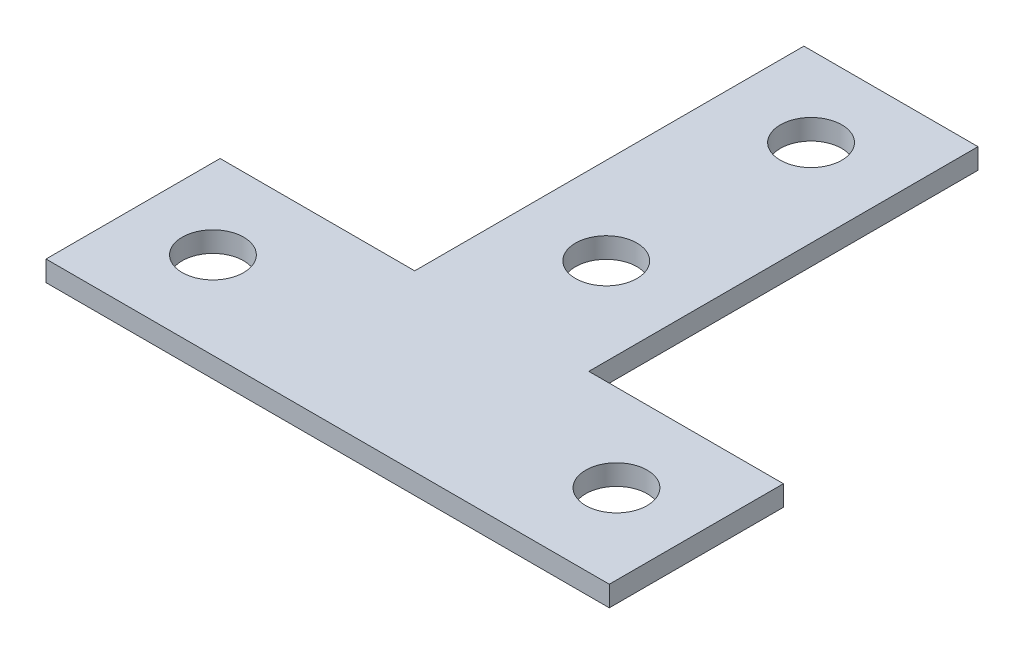
ISO-10303-21;
HEADER;
FILE_DESCRIPTION(('STEP AP214'),'2;1');
FILE_NAME('part.step','',(''),(''),'','','');
FILE_SCHEMA(('AUTOMOTIVE_DESIGN { 1 0 10303 214 1 1 1 1 }'));
ENDSEC;
DATA;
#1=APPLICATION_CONTEXT('core data for automotive mechanical design processes');
#2=APPLICATION_PROTOCOL_DEFINITION('international standard','automotive_design',2000,#1);
#3=PRODUCT_CONTEXT('',#1,'mechanical');
#4=PRODUCT('Part','Part','',(#3));
#5=PRODUCT_RELATED_PRODUCT_CATEGORY('part','',(#4));
#6=PRODUCT_DEFINITION_FORMATION('','',#4);
#7=PRODUCT_DEFINITION_CONTEXT('part definition',#1,'design');
#8=PRODUCT_DEFINITION('design','',#6,#7);
#9=PRODUCT_DEFINITION_SHAPE('','',#8);
#10=(LENGTH_UNIT() NAMED_UNIT(*) SI_UNIT(.MILLI.,.METRE.));
#11=(NAMED_UNIT(*) PLANE_ANGLE_UNIT() SI_UNIT($,.RADIAN.));
#12=(NAMED_UNIT(*) SI_UNIT($,.STERADIAN.) SOLID_ANGLE_UNIT());
#13=UNCERTAINTY_MEASURE_WITH_UNIT(LENGTH_MEASURE(1.E-05),#10,'distance_accuracy_value','');
#14=(GEOMETRIC_REPRESENTATION_CONTEXT(3) GLOBAL_UNCERTAINTY_ASSIGNED_CONTEXT((#13)) GLOBAL_UNIT_ASSIGNED_CONTEXT((#10,
#11,#12)) REPRESENTATION_CONTEXT('',''));
#15=CARTESIAN_POINT('',(0.,0.,0.));
#16=DIRECTION('',(0.,0.,1.));
#17=DIRECTION('',(1.,0.,0.));
#18=AXIS2_PLACEMENT_3D('',#15,#16,#17);
#19=CARTESIAN_POINT('',(27.5,2.,-27.5));
#20=DIRECTION('',(-1.,0.,0.));
#21=DIRECTION('',(0.,0.,1.));
#22=AXIS2_PLACEMENT_3D('',#19,#20,#21);
#23=PLANE('',#22);
#24=DIRECTION('',(0.,0.,-1.));
#25=VECTOR('',#24,1.);
#26=CARTESIAN_POINT('',(27.5,0.,-27.5));
#27=LINE('',#26,#25);
#28=CARTESIAN_POINT('',(27.5,0.,27.5));
#29=VERTEX_POINT('',#28);
#30=CARTESIAN_POINT('',(27.5000000000001,0.,10.4999999999998));
#31=VERTEX_POINT('',#30);
#32=EDGE_CURVE('E135',#29,#31,#27,.T.);
#33=ORIENTED_EDGE('',*,*,#32,.T.);
#34=DIRECTION('',(0.,1.,0.));
#35=VECTOR('',#34,1.);
#36=CARTESIAN_POINT('',(27.5000000000001,0.,10.4999999999998));
#37=LINE('',#36,#35);
#38=CARTESIAN_POINT('',(27.5000000000001,2.,10.4999999999998));
#39=VERTEX_POINT('',#38);
#40=EDGE_CURVE('E183',#31,#39,#37,.T.);
#41=ORIENTED_EDGE('',*,*,#40,.T.);
#42=DIRECTION('',(0.,0.,-1.));
#43=VECTOR('',#42,1.);
#44=CARTESIAN_POINT('',(27.5,2.,-27.5));
#45=LINE('',#44,#43);
#46=CARTESIAN_POINT('',(27.5,2.,27.5));
#47=VERTEX_POINT('',#46);
#48=EDGE_CURVE('E132',#47,#39,#45,.T.);
#49=ORIENTED_EDGE('',*,*,#48,.F.);
#50=DIRECTION('',(0.,-1.,0.));
#51=VECTOR('',#50,1.);
#52=CARTESIAN_POINT('',(27.5,2.,27.5));
#53=LINE('',#52,#51);
#54=EDGE_CURVE('E47',#47,#29,#53,.T.);
#55=ORIENTED_EDGE('',*,*,#54,.T.);
#56=EDGE_LOOP('',(#33,#41,#49,#55));
#57=FACE_BOUND('',#56,.T.);
#58=ADVANCED_FACE('F39',(#57),#23,.F.);
#59=CARTESIAN_POINT('',(-27.5,2.,-27.5));
#60=DIRECTION('',(0.,0.,1.));
#61=DIRECTION('',(1.,0.,0.));
#62=AXIS2_PLACEMENT_3D('',#59,#60,#61);
#63=PLANE('',#62);
#64=DIRECTION('',(-1.,0.,0.));
#65=VECTOR('',#64,1.);
#66=CARTESIAN_POINT('',(-27.5,0.,-27.5));
#67=LINE('',#66,#65);
#68=CARTESIAN_POINT('',(8.49999999999981,0.,-27.5));
#69=VERTEX_POINT('',#68);
#70=CARTESIAN_POINT('',(-8.5,0.,-27.5));
#71=VERTEX_POINT('',#70);
#72=EDGE_CURVE('E128',#69,#71,#67,.T.);
#73=ORIENTED_EDGE('',*,*,#72,.T.);
#74=DIRECTION('',(0.,1.,0.));
#75=VECTOR('',#74,1.);
#76=CARTESIAN_POINT('',(-8.5,0.,-27.5));
#77=LINE('',#76,#75);
#78=CARTESIAN_POINT('',(-8.5,2.,-27.5));
#79=VERTEX_POINT('',#78);
#80=EDGE_CURVE('E155',#71,#79,#77,.T.);
#81=ORIENTED_EDGE('',*,*,#80,.T.);
#82=DIRECTION('',(-1.,0.,0.));
#83=VECTOR('',#82,1.);
#84=CARTESIAN_POINT('',(-27.5,2.,-27.5));
#85=LINE('',#84,#83);
#86=CARTESIAN_POINT('',(8.49999999999981,2.,-27.5));
#87=VERTEX_POINT('',#86);
#88=EDGE_CURVE('E151',#87,#79,#85,.T.);
#89=ORIENTED_EDGE('',*,*,#88,.F.);
#90=DIRECTION('',(0.,1.,0.));
#91=VECTOR('',#90,1.);
#92=CARTESIAN_POINT('',(8.49999999999981,0.,-27.5));
#93=LINE('',#92,#91);
#94=EDGE_CURVE('E175',#69,#87,#93,.T.);
#95=ORIENTED_EDGE('',*,*,#94,.F.);
#96=EDGE_LOOP('',(#73,#81,#89,#95));
#97=FACE_BOUND('',#96,.T.);
#98=ADVANCED_FACE('F199',(#97),#63,.F.);
#99=CARTESIAN_POINT('',(-27.5,2.,-27.5));
#100=DIRECTION('',(1.,0.,0.));
#101=DIRECTION('',(0.,0.,-1.));
#102=AXIS2_PLACEMENT_3D('',#99,#100,#101);
#103=PLANE('',#102);
#104=DIRECTION('',(0.,0.,1.));
#105=VECTOR('',#104,1.);
#106=CARTESIAN_POINT('',(-27.5,2.,-27.5));
#107=LINE('',#106,#105);
#108=CARTESIAN_POINT('',(-27.5,2.,10.5));
#109=VERTEX_POINT('',#108);
#110=CARTESIAN_POINT('',(-27.5,2.,27.5));
#111=VERTEX_POINT('',#110);
#112=EDGE_CURVE('E120',#109,#111,#107,.T.);
#113=ORIENTED_EDGE('',*,*,#112,.F.);
#114=DIRECTION('',(0.,1.,0.));
#115=VECTOR('',#114,1.);
#116=CARTESIAN_POINT('',(-27.5,0.,10.5));
#117=LINE('',#116,#115);
#118=CARTESIAN_POINT('',(-27.5,0.,10.5));
#119=VERTEX_POINT('',#118);
#120=EDGE_CURVE('E107',#119,#109,#117,.T.);
#121=ORIENTED_EDGE('',*,*,#120,.F.);
#122=DIRECTION('',(0.,0.,1.));
#123=VECTOR('',#122,1.);
#124=CARTESIAN_POINT('',(-27.5,0.,-27.5));
#125=LINE('',#124,#123);
#126=CARTESIAN_POINT('',(-27.5,0.,27.5));
#127=VERTEX_POINT('',#126);
#128=EDGE_CURVE('E119',#119,#127,#125,.T.);
#129=ORIENTED_EDGE('',*,*,#128,.T.);
#130=DIRECTION('',(0.,-1.,0.));
#131=VECTOR('',#130,1.);
#132=CARTESIAN_POINT('',(-27.5,2.,27.5));
#133=LINE('',#132,#131);
#134=EDGE_CURVE('E11',#111,#127,#133,.T.);
#135=ORIENTED_EDGE('',*,*,#134,.F.);
#136=EDGE_LOOP('',(#113,#121,#129,#135));
#137=FACE_BOUND('',#136,.T.);
#138=ADVANCED_FACE('F117',(#137),#103,.F.);
#139=CARTESIAN_POINT('',(-27.5,2.,27.5));
#140=DIRECTION('',(0.,0.,-1.));
#141=DIRECTION('',(-1.,0.,0.));
#142=AXIS2_PLACEMENT_3D('',#139,#140,#141);
#143=PLANE('',#142);
#144=DIRECTION('',(1.,0.,0.));
#145=VECTOR('',#144,1.);
#146=CARTESIAN_POINT('',(-27.5,0.,27.5));
#147=LINE('',#146,#145);
#148=EDGE_CURVE('E126',#127,#29,#147,.T.);
#149=ORIENTED_EDGE('',*,*,#148,.T.);
#150=ORIENTED_EDGE('',*,*,#54,.F.);
#151=DIRECTION('',(1.,0.,0.));
#152=VECTOR('',#151,1.);
#153=CARTESIAN_POINT('',(-27.5,2.,27.5));
#154=LINE('',#153,#152);
#155=EDGE_CURVE('E140',#111,#47,#154,.T.);
#156=ORIENTED_EDGE('',*,*,#155,.F.);
#157=ORIENTED_EDGE('',*,*,#134,.T.);
#158=EDGE_LOOP('',(#149,#150,#156,#157));
#159=FACE_BOUND('',#158,.T.);
#160=ADVANCED_FACE('F227',(#159),#143,.F.);
#161=CARTESIAN_POINT('',(0.,2.,0.));
#162=DIRECTION('',(0.,1.,0.));
#163=DIRECTION('',(0.,0.,1.));
#164=AXIS2_PLACEMENT_3D('',#161,#162,#163);
#165=PLANE('',#164);
#166=CARTESIAN_POINT('',(-19.7,2.,19.));
#167=DIRECTION('',(0.,1.,0.));
#168=DIRECTION('',(0.,0.,1.));
#169=AXIS2_PLACEMENT_3D('',#166,#167,#168);
#170=CIRCLE('',#169,3.);
#171=CARTESIAN_POINT('',(-19.7,2.,22.));
#172=VERTEX_POINT('',#171);
#173=EDGE_CURVE('E317',#172,#172,#170,.T.);
#174=ORIENTED_EDGE('',*,*,#173,.F.);
#175=EDGE_LOOP('',(#174));
#176=FACE_BOUND('',#175,.T.);
#177=CARTESIAN_POINT('',(19.7,2.,19.));
#178=DIRECTION('',(0.,1.,0.));
#179=DIRECTION('',(0.,0.,1.));
#180=AXIS2_PLACEMENT_3D('',#177,#178,#179);
#181=CIRCLE('',#180,3.);
#182=CARTESIAN_POINT('',(19.7,2.,22.));
#183=VERTEX_POINT('',#182);
#184=EDGE_CURVE('E325',#183,#183,#181,.T.);
#185=ORIENTED_EDGE('',*,*,#184,.F.);
#186=EDGE_LOOP('',(#185));
#187=FACE_BOUND('',#186,.T.);
#188=CARTESIAN_POINT('',(0.,2.,0.299999999999998));
#189=DIRECTION('',(0.,1.,0.));
#190=DIRECTION('',(0.,0.,1.));
#191=AXIS2_PLACEMENT_3D('',#188,#189,#190);
#192=CIRCLE('',#191,3.);
#193=CARTESIAN_POINT('',(0.,2.,3.3));
#194=VERTEX_POINT('',#193);
#195=EDGE_CURVE('E335',#194,#194,#192,.T.);
#196=ORIENTED_EDGE('',*,*,#195,.F.);
#197=EDGE_LOOP('',(#196));
#198=FACE_BOUND('',#197,.T.);
#199=CARTESIAN_POINT('',(0.,2.,-19.7));
#200=DIRECTION('',(0.,1.,0.));
#201=DIRECTION('',(0.,0.,1.));
#202=AXIS2_PLACEMENT_3D('',#199,#200,#201);
#203=CIRCLE('',#202,3.);
#204=CARTESIAN_POINT('',(0.,2.,-16.7));
#205=VERTEX_POINT('',#204);
#206=EDGE_CURVE('E342',#205,#205,#203,.T.);
#207=ORIENTED_EDGE('',*,*,#206,.F.);
#208=EDGE_LOOP('',(#207));
#209=FACE_BOUND('',#208,.T.);
#210=DIRECTION('',(0.,0.,-1.));
#211=VECTOR('',#210,1.);
#212=CARTESIAN_POINT('',(-8.5,2.,10.5));
#213=LINE('',#212,#211);
#214=CARTESIAN_POINT('',(-8.5,2.,10.5));
#215=VERTEX_POINT('',#214);
#216=EDGE_CURVE('E113',#215,#79,#213,.T.);
#217=ORIENTED_EDGE('',*,*,#216,.F.);
#218=DIRECTION('',(1.,0.,0.));
#219=VECTOR('',#218,1.);
#220=CARTESIAN_POINT('',(-27.5,2.,10.5));
#221=LINE('',#220,#219);
#222=EDGE_CURVE('E186',#109,#215,#221,.T.);
#223=ORIENTED_EDGE('',*,*,#222,.F.);
#224=ORIENTED_EDGE('',*,*,#112,.T.);
#225=ORIENTED_EDGE('',*,*,#155,.T.);
#226=ORIENTED_EDGE('',*,*,#48,.T.);
#227=DIRECTION('',(1.,0.,0.));
#228=VECTOR('',#227,1.);
#229=CARTESIAN_POINT('',(27.5000000000001,2.,10.4999999999998));
#230=LINE('',#229,#228);
#231=CARTESIAN_POINT('',(8.50000000000007,2.,10.5));
#232=VERTEX_POINT('',#231);
#233=EDGE_CURVE('E172',#232,#39,#230,.T.);
#234=ORIENTED_EDGE('',*,*,#233,.F.);
#235=DIRECTION('',(0.,0.,1.));
#236=VECTOR('',#235,1.);
#237=CARTESIAN_POINT('',(8.50000000000007,2.,10.5));
#238=LINE('',#237,#236);
#239=EDGE_CURVE('E176',#87,#232,#238,.T.);
#240=ORIENTED_EDGE('',*,*,#239,.F.);
#241=ORIENTED_EDGE('',*,*,#88,.T.);
#242=EDGE_LOOP('',(#217,#223,#224,#225,#226,#234,#240,#241));
#243=FACE_BOUND('',#242,.T.);
#244=ADVANCED_FACE('F196',(#176,#187,#198,#209,#243),#165,.T.);
#245=CARTESIAN_POINT('',(0.,0.,0.));
#246=DIRECTION('',(0.,1.,0.));
#247=DIRECTION('',(0.,0.,1.));
#248=AXIS2_PLACEMENT_3D('',#245,#246,#247);
#249=PLANE('',#248);
#250=CARTESIAN_POINT('',(-19.7,0.,19.));
#251=DIRECTION('',(0.,1.,0.));
#252=DIRECTION('',(0.,0.,1.));
#253=AXIS2_PLACEMENT_3D('',#250,#251,#252);
#254=CIRCLE('',#253,3.);
#255=CARTESIAN_POINT('',(-19.7,0.,22.));
#256=VERTEX_POINT('',#255);
#257=EDGE_CURVE('E180',#256,#256,#254,.T.);
#258=ORIENTED_EDGE('',*,*,#257,.T.);
#259=EDGE_LOOP('',(#258));
#260=FACE_BOUND('',#259,.T.);
#261=CARTESIAN_POINT('',(19.7,0.,19.));
#262=DIRECTION('',(0.,1.,0.));
#263=DIRECTION('',(0.,0.,1.));
#264=AXIS2_PLACEMENT_3D('',#261,#262,#263);
#265=CIRCLE('',#264,3.);
#266=CARTESIAN_POINT('',(19.7,0.,22.));
#267=VERTEX_POINT('',#266);
#268=EDGE_CURVE('E319',#267,#267,#265,.T.);
#269=ORIENTED_EDGE('',*,*,#268,.T.);
#270=EDGE_LOOP('',(#269));
#271=FACE_BOUND('',#270,.T.);
#272=CARTESIAN_POINT('',(0.,0.,0.299999999999998));
#273=DIRECTION('',(0.,1.,0.));
#274=DIRECTION('',(0.,0.,1.));
#275=AXIS2_PLACEMENT_3D('',#272,#273,#274);
#276=CIRCLE('',#275,3.);
#277=CARTESIAN_POINT('',(0.,0.,3.3));
#278=VERTEX_POINT('',#277);
#279=EDGE_CURVE('E331',#278,#278,#276,.T.);
#280=ORIENTED_EDGE('',*,*,#279,.T.);
#281=EDGE_LOOP('',(#280));
#282=FACE_BOUND('',#281,.T.);
#283=CARTESIAN_POINT('',(0.,0.,-19.7));
#284=DIRECTION('',(0.,1.,0.));
#285=DIRECTION('',(0.,0.,1.));
#286=AXIS2_PLACEMENT_3D('',#283,#284,#285);
#287=CIRCLE('',#286,3.);
#288=CARTESIAN_POINT('',(0.,0.,-16.7));
#289=VERTEX_POINT('',#288);
#290=EDGE_CURVE('E339',#289,#289,#287,.T.);
#291=ORIENTED_EDGE('',*,*,#290,.T.);
#292=EDGE_LOOP('',(#291));
#293=FACE_BOUND('',#292,.T.);
#294=DIRECTION('',(1.,0.,0.));
#295=VECTOR('',#294,1.);
#296=CARTESIAN_POINT('',(-27.5,0.,10.5));
#297=LINE('',#296,#295);
#298=CARTESIAN_POINT('',(-8.5,0.,10.5));
#299=VERTEX_POINT('',#298);
#300=EDGE_CURVE('E103',#119,#299,#297,.T.);
#301=ORIENTED_EDGE('',*,*,#300,.T.);
#302=DIRECTION('',(0.,0.,-1.));
#303=VECTOR('',#302,1.);
#304=CARTESIAN_POINT('',(-8.5,0.,10.5));
#305=LINE('',#304,#303);
#306=EDGE_CURVE('E54',#299,#71,#305,.T.);
#307=ORIENTED_EDGE('',*,*,#306,.T.);
#308=ORIENTED_EDGE('',*,*,#72,.F.);
#309=DIRECTION('',(0.,0.,1.));
#310=VECTOR('',#309,1.);
#311=CARTESIAN_POINT('',(8.50000000000007,0.,10.5));
#312=LINE('',#311,#310);
#313=CARTESIAN_POINT('',(8.50000000000007,0.,10.5));
#314=VERTEX_POINT('',#313);
#315=EDGE_CURVE('E168',#69,#314,#312,.T.);
#316=ORIENTED_EDGE('',*,*,#315,.T.);
#317=DIRECTION('',(1.,0.,0.));
#318=VECTOR('',#317,1.);
#319=CARTESIAN_POINT('',(27.5000000000001,0.,10.4999999999998));
#320=LINE('',#319,#318);
#321=EDGE_CURVE('E62',#314,#31,#320,.T.);
#322=ORIENTED_EDGE('',*,*,#321,.T.);
#323=ORIENTED_EDGE('',*,*,#32,.F.);
#324=ORIENTED_EDGE('',*,*,#148,.F.);
#325=ORIENTED_EDGE('',*,*,#128,.F.);
#326=EDGE_LOOP('',(#301,#307,#308,#316,#322,#323,#324,#325));
#327=FACE_BOUND('',#326,.T.);
#328=ADVANCED_FACE('F124',(#260,#271,#282,#293,#327),#249,.F.);
#329=CARTESIAN_POINT('',(27.5000000000001,0.,10.4999999999998));
#330=DIRECTION('',(0.,0.,1.));
#331=DIRECTION('',(1.,0.,0.));
#332=AXIS2_PLACEMENT_3D('',#329,#330,#331);
#333=PLANE('',#332);
#334=ORIENTED_EDGE('',*,*,#233,.T.);
#335=ORIENTED_EDGE('',*,*,#40,.F.);
#336=ORIENTED_EDGE('',*,*,#321,.F.);
#337=DIRECTION('',(0.,1.,0.));
#338=VECTOR('',#337,1.);
#339=CARTESIAN_POINT('',(8.50000000000007,0.,10.5));
#340=LINE('',#339,#338);
#341=EDGE_CURVE('E187',#314,#232,#340,.T.);
#342=ORIENTED_EDGE('',*,*,#341,.T.);
#343=EDGE_LOOP('',(#334,#335,#336,#342));
#344=FACE_BOUND('',#343,.T.);
#345=ADVANCED_FACE('F217',(#344),#333,.F.);
#346=CARTESIAN_POINT('',(8.50000000000007,0.,10.5));
#347=DIRECTION('',(-1.,0.,0.));
#348=DIRECTION('',(0.,0.,1.));
#349=AXIS2_PLACEMENT_3D('',#346,#347,#348);
#350=PLANE('',#349);
#351=ORIENTED_EDGE('',*,*,#239,.T.);
#352=ORIENTED_EDGE('',*,*,#341,.F.);
#353=ORIENTED_EDGE('',*,*,#315,.F.);
#354=ORIENTED_EDGE('',*,*,#94,.T.);
#355=EDGE_LOOP('',(#351,#352,#353,#354));
#356=FACE_BOUND('',#355,.T.);
#357=ADVANCED_FACE('F209',(#356),#350,.F.);
#358=CARTESIAN_POINT('',(-8.5,0.,10.5));
#359=DIRECTION('',(1.,0.,0.));
#360=DIRECTION('',(0.,0.,-1.));
#361=AXIS2_PLACEMENT_3D('',#358,#359,#360);
#362=PLANE('',#361);
#363=ORIENTED_EDGE('',*,*,#216,.T.);
#364=ORIENTED_EDGE('',*,*,#80,.F.);
#365=ORIENTED_EDGE('',*,*,#306,.F.);
#366=DIRECTION('',(0.,1.,0.));
#367=VECTOR('',#366,1.);
#368=CARTESIAN_POINT('',(-8.5,0.,10.5));
#369=LINE('',#368,#367);
#370=EDGE_CURVE('E109',#299,#215,#369,.T.);
#371=ORIENTED_EDGE('',*,*,#370,.T.);
#372=EDGE_LOOP('',(#363,#364,#365,#371));
#373=FACE_BOUND('',#372,.T.);
#374=ADVANCED_FACE('F207',(#373),#362,.F.);
#375=CARTESIAN_POINT('',(-27.5,0.,10.5));
#376=DIRECTION('',(0.,0.,1.));
#377=DIRECTION('',(1.,0.,0.));
#378=AXIS2_PLACEMENT_3D('',#375,#376,#377);
#379=PLANE('',#378);
#380=ORIENTED_EDGE('',*,*,#222,.T.);
#381=ORIENTED_EDGE('',*,*,#370,.F.);
#382=ORIENTED_EDGE('',*,*,#300,.F.);
#383=ORIENTED_EDGE('',*,*,#120,.T.);
#384=EDGE_LOOP('',(#380,#381,#382,#383));
#385=FACE_BOUND('',#384,.T.);
#386=ADVANCED_FACE('F106',(#385),#379,.F.);
#387=CARTESIAN_POINT('',(0.,0.,-19.7));
#388=DIRECTION('',(0.,1.,0.));
#389=DIRECTION('',(0.,0.,1.));
#390=AXIS2_PLACEMENT_3D('',#387,#388,#389);
#391=CYLINDRICAL_SURFACE('',#390,3.);
#392=ORIENTED_EDGE('',*,*,#290,.F.);
#393=EDGE_LOOP('',(#392));
#394=FACE_BOUND('',#393,.T.);
#395=ORIENTED_EDGE('',*,*,#206,.T.);
#396=EDGE_LOOP('',(#395));
#397=FACE_BOUND('',#396,.T.);
#398=ADVANCED_FACE('F215',(#394,#397),#391,.F.);
#399=CARTESIAN_POINT('',(0.,0.,0.299999999999998));
#400=DIRECTION('',(0.,1.,0.));
#401=DIRECTION('',(0.,0.,1.));
#402=AXIS2_PLACEMENT_3D('',#399,#400,#401);
#403=CYLINDRICAL_SURFACE('',#402,3.);
#404=ORIENTED_EDGE('',*,*,#279,.F.);
#405=EDGE_LOOP('',(#404));
#406=FACE_BOUND('',#405,.T.);
#407=ORIENTED_EDGE('',*,*,#195,.T.);
#408=EDGE_LOOP('',(#407));
#409=FACE_BOUND('',#408,.T.);
#410=ADVANCED_FACE('F279',(#406,#409),#403,.F.);
#411=CARTESIAN_POINT('',(19.7,0.,19.));
#412=DIRECTION('',(0.,1.,0.));
#413=DIRECTION('',(0.,0.,1.));
#414=AXIS2_PLACEMENT_3D('',#411,#412,#413);
#415=CYLINDRICAL_SURFACE('',#414,3.);
#416=ORIENTED_EDGE('',*,*,#268,.F.);
#417=EDGE_LOOP('',(#416));
#418=FACE_BOUND('',#417,.T.);
#419=ORIENTED_EDGE('',*,*,#184,.T.);
#420=EDGE_LOOP('',(#419));
#421=FACE_BOUND('',#420,.T.);
#422=ADVANCED_FACE('F288',(#418,#421),#415,.F.);
#423=CARTESIAN_POINT('',(-19.7,0.,19.));
#424=DIRECTION('',(0.,1.,0.));
#425=DIRECTION('',(0.,0.,1.));
#426=AXIS2_PLACEMENT_3D('',#423,#424,#425);
#427=CYLINDRICAL_SURFACE('',#426,3.);
#428=ORIENTED_EDGE('',*,*,#257,.F.);
#429=EDGE_LOOP('',(#428));
#430=FACE_BOUND('',#429,.T.);
#431=ORIENTED_EDGE('',*,*,#173,.T.);
#432=EDGE_LOOP('',(#431));
#433=FACE_BOUND('',#432,.T.);
#434=ADVANCED_FACE('F298',(#430,#433),#427,.F.);
#435=CLOSED_SHELL('',(#58,#98,#138,#160,#244,#328,#345,#357,#374,#386,#398,#410,#422,#434));
#436=MANIFOLD_SOLID_BREP('B2',#435);
#437=ADVANCED_BREP_SHAPE_REPRESENTATION('',(#18,#436),#14);
#438=SHAPE_DEFINITION_REPRESENTATION(#9,#437);
ENDSEC;
END-ISO-10303-21;
